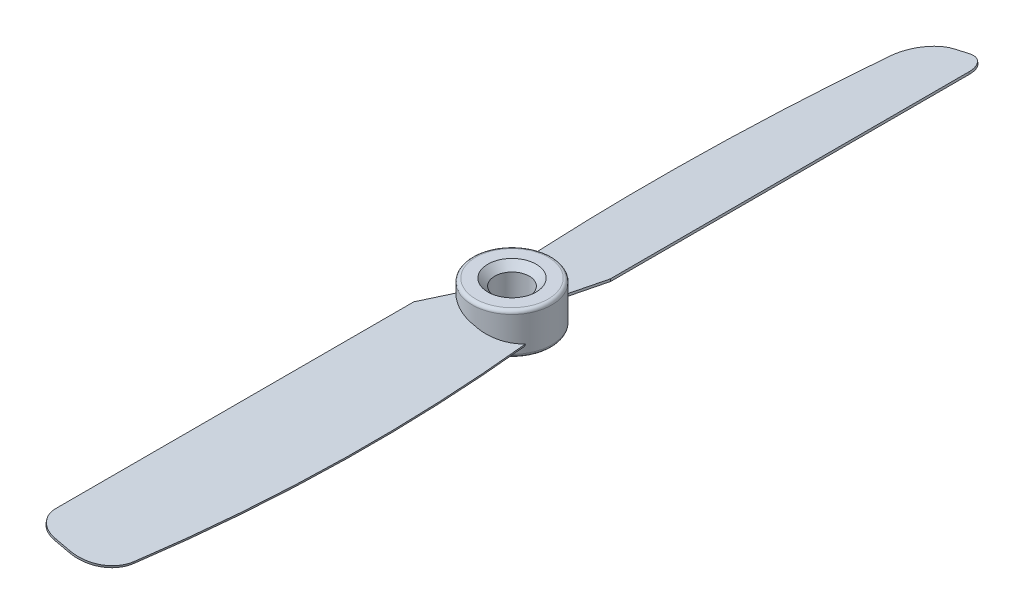
ISO-10303-21;
HEADER;
FILE_DESCRIPTION(('STEP AP214'),'2;1');
FILE_NAME('part.step','',(''),(''),'','','');
FILE_SCHEMA(('AUTOMOTIVE_DESIGN { 1 0 10303 214 1 1 1 1 }'));
ENDSEC;
DATA;
#1=APPLICATION_CONTEXT('core data for automotive mechanical design processes');
#2=APPLICATION_PROTOCOL_DEFINITION('international standard','automotive_design',2000,#1);
#3=PRODUCT_CONTEXT('',#1,'mechanical');
#4=PRODUCT('Part','Part','',(#3));
#5=PRODUCT_RELATED_PRODUCT_CATEGORY('part','',(#4));
#6=PRODUCT_DEFINITION_FORMATION('','',#4);
#7=PRODUCT_DEFINITION_CONTEXT('part definition',#1,'design');
#8=PRODUCT_DEFINITION('design','',#6,#7);
#9=PRODUCT_DEFINITION_SHAPE('','',#8);
#10=(LENGTH_UNIT() NAMED_UNIT(*) SI_UNIT(.MILLI.,.METRE.));
#11=(NAMED_UNIT(*) PLANE_ANGLE_UNIT() SI_UNIT($,.RADIAN.));
#12=(NAMED_UNIT(*) SI_UNIT($,.STERADIAN.) SOLID_ANGLE_UNIT());
#13=UNCERTAINTY_MEASURE_WITH_UNIT(LENGTH_MEASURE(1.E-05),#10,'distance_accuracy_value','');
#14=(GEOMETRIC_REPRESENTATION_CONTEXT(3) GLOBAL_UNCERTAINTY_ASSIGNED_CONTEXT((#13)) GLOBAL_UNIT_ASSIGNED_CONTEXT((#10,
#11,#12)) REPRESENTATION_CONTEXT('',''));
#15=CARTESIAN_POINT('',(0.,0.,0.));
#16=DIRECTION('',(0.,0.,1.));
#17=DIRECTION('',(1.,0.,0.));
#18=AXIS2_PLACEMENT_3D('',#15,#16,#17);
#19=CARTESIAN_POINT('',(0.,3.,0.));
#20=DIRECTION('',(0.,-1.,0.));
#21=DIRECTION('',(0.,0.,-1.));
#22=AXIS2_PLACEMENT_3D('',#19,#20,#21);
#23=CYLINDRICAL_SURFACE('',#22,5.75);
#24=CARTESIAN_POINT('',(0.,2.5,0.));
#25=DIRECTION('',(0.,1.,0.));
#26=DIRECTION('',(0.,0.,1.));
#27=AXIS2_PLACEMENT_3D('',#24,#25,#26);
#28=CIRCLE('',#27,5.75);
#29=CARTESIAN_POINT('',(0.,2.5,5.75));
#30=VERTEX_POINT('',#29);
#31=EDGE_CURVE('E397',#30,#30,#28,.F.);
#32=ORIENTED_EDGE('',*,*,#31,.T.);
#33=EDGE_LOOP('',(#32));
#34=FACE_BOUND('',#33,.T.);
#35=CARTESIAN_POINT('',(0.,-2.5,0.));
#36=DIRECTION('',(0.,1.,0.));
#37=DIRECTION('',(0.,0.,1.));
#38=AXIS2_PLACEMENT_3D('',#35,#36,#37);
#39=CIRCLE('',#38,5.75);
#40=CARTESIAN_POINT('',(0.,-2.5,5.75));
#41=VERTEX_POINT('',#40);
#42=EDGE_CURVE('E392',#41,#41,#39,.T.);
#43=ORIENTED_EDGE('',*,*,#42,.T.);
#44=EDGE_LOOP('',(#43));
#45=FACE_BOUND('',#44,.T.);
#46=CARTESIAN_POINT('',(0.,-0.153945616169008,0.));
#47=DIRECTION('',(0.224951054343866,0.974370064785235,0.));
#48=DIRECTION('',(0.974370064785235,-0.224951054343866,0.));
#49=AXIS2_PLACEMENT_3D('',#46,#47,#48);
#50=ELLIPSE('',#49,5.901248619812,5.75);
#51=CARTESIAN_POINT('',(-4.13908294867461,0.801636977110163,3.99130208628601));
#52=VERTEX_POINT('',#51);
#53=CARTESIAN_POINT('',(0.320003598355035,-0.227824268074907,5.74108854635071));
#54=VERTEX_POINT('',#53);
#55=EDGE_CURVE('E381',#52,#54,#50,.T.);
#56=ORIENTED_EDGE('',*,*,#55,.F.);
#57=CARTESIAN_POINT('',(0.,12.3222763067518,0.));
#58=DIRECTION('',(0.916439126793901,-0.211576643479599,0.33966844247757));
#59=DIRECTION('',(-0.198388347034774,-0.977361409067243,-0.0735305366966899));
#60=AXIS2_PLACEMENT_3D('',#57,#58,#59);
#61=ELLIPSE('',#60,27.1769128455544,5.75);
#62=CARTESIAN_POINT('',(-4.08947714195062,1.09807580658049,4.04211290112775));
#63=VERTEX_POINT('',#62);
#64=EDGE_CURVE('E379',#63,#52,#61,.T.);
#65=ORIENTED_EDGE('',*,*,#64,.F.);
#66=CARTESIAN_POINT('',(0.,0.153945616169009,0.));
#67=DIRECTION('',(0.224951054343866,0.974370064785235,0.));
#68=DIRECTION('',(0.974370064785235,-0.224951054343866,0.));
#69=AXIS2_PLACEMENT_3D('',#66,#67,#68);
#70=ELLIPSE('',#69,5.901248619812,5.75);
#71=CARTESIAN_POINT('',(0.354622157582683,0.0720746401148501,5.73905420129059));
#72=VERTEX_POINT('',#71);
#73=EDGE_CURVE('E374',#63,#72,#70,.T.);
#74=ORIENTED_EDGE('',*,*,#73,.T.);
#75=CARTESIAN_POINT('',(0.320003598355667,-0.227824268075053,5.7410885463507));
#76=CARTESIAN_POINT('',(0.325773371717421,-0.177840999841731,5.74076694689687));
#77=CARTESIAN_POINT('',(0.331543138333911,-0.127857790042578,5.74043661841495));
#78=CARTESIAN_POINT('',(0.343082658076362,-0.0278914873126147,5.73975850339491));
#79=CARTESIAN_POINT('',(0.348852411202323,0.0220916056181969,5.7394107168568));
#80=CARTESIAN_POINT('',(0.35462215758302,0.0720746401148383,5.73905420129059));
#81=B_SPLINE_CURVE_WITH_KNOTS('',3,(#75,#76,#77,#78,#79,#80),.UNSPECIFIED.,.F.,.F.,(4,2,4),(0.,
0.150948617979321,0.301897235958643),.UNSPECIFIED.);
#82=EDGE_CURVE('E226',#54,#72,#81,.T.);
#83=ORIENTED_EDGE('',*,*,#82,.F.);
#84=EDGE_LOOP('',(#56,#65,#74,#83));
#85=FACE_BOUND('',#84,.T.);
#86=CARTESIAN_POINT('',(0.,-0.153945616169008,0.));
#87=DIRECTION('',(-0.224951054343866,0.974370064785235,0.));
#88=DIRECTION('',(-0.974370064785235,-0.224951054343866,0.));
#89=AXIS2_PLACEMENT_3D('',#86,#87,#88);
#90=ELLIPSE('',#89,5.901248619812,5.75);
#91=CARTESIAN_POINT('',(4.13908294867461,0.801636977110163,-3.99130208628601));
#92=VERTEX_POINT('',#91);
#93=CARTESIAN_POINT('',(-0.320003598355035,-0.227824268074907,-5.74108854635071));
#94=VERTEX_POINT('',#93);
#95=EDGE_CURVE('E389',#92,#94,#90,.T.);
#96=ORIENTED_EDGE('',*,*,#95,.F.);
#97=CARTESIAN_POINT('',(0.,12.3222763067518,0.));
#98=DIRECTION('',(-0.916439126793901,-0.211576643479599,-0.33966844247757));
#99=DIRECTION('',(0.198388347034774,-0.977361409067243,0.0735305366966899));
#100=AXIS2_PLACEMENT_3D('',#97,#98,#99);
#101=ELLIPSE('',#100,27.1769128455544,5.75);
#102=CARTESIAN_POINT('',(4.08947714195062,1.09807580658049,-4.04211290112775));
#103=VERTEX_POINT('',#102);
#104=EDGE_CURVE('E243',#103,#92,#101,.T.);
#105=ORIENTED_EDGE('',*,*,#104,.F.);
#106=CARTESIAN_POINT('',(0.,0.153945616169009,0.));
#107=DIRECTION('',(-0.224951054343866,0.974370064785235,0.));
#108=DIRECTION('',(-0.974370064785235,-0.224951054343866,0.));
#109=AXIS2_PLACEMENT_3D('',#106,#107,#108);
#110=ELLIPSE('',#109,5.901248619812,5.75);
#111=CARTESIAN_POINT('',(-0.354622157582683,0.0720746401148501,-5.73905420129059));
#112=VERTEX_POINT('',#111);
#113=EDGE_CURVE('E244',#103,#112,#110,.T.);
#114=ORIENTED_EDGE('',*,*,#113,.T.);
#115=CARTESIAN_POINT('',(-0.320003598355667,-0.227824268075053,-5.7410885463507));
#116=CARTESIAN_POINT('',(-0.325773371717421,-0.177840999841731,-5.74076694689687));
#117=CARTESIAN_POINT('',(-0.331543138333911,-0.127857790042578,-5.74043661841495));
#118=CARTESIAN_POINT('',(-0.343082658076362,-0.0278914873126147,-5.73975850339491));
#119=CARTESIAN_POINT('',(-0.348852411202323,0.0220916056181969,-5.7394107168568));
#120=CARTESIAN_POINT('',(-0.35462215758302,0.0720746401148383,-5.73905420129059));
#121=B_SPLINE_CURVE_WITH_KNOTS('',3,(#115,#116,#117,#118,#119,#120),.UNSPECIFIED.,.F.,.F.,(4,2,
4),(0.,0.150948617979321,0.301897235958643),.UNSPECIFIED.);
#122=EDGE_CURVE('E235',#94,#112,#121,.T.);
#123=ORIENTED_EDGE('',*,*,#122,.F.);
#124=EDGE_LOOP('',(#96,#105,#114,#123));
#125=FACE_BOUND('',#124,.T.);
#126=ADVANCED_FACE('F43',(#34,#45,#85,#125),#23,.T.);
#127=CARTESIAN_POINT('',(0.,3.,0.));
#128=DIRECTION('',(0.,1.,0.));
#129=DIRECTION('',(0.,0.,1.));
#130=AXIS2_PLACEMENT_3D('',#127,#128,#129);
#131=PLANE('',#130);
#132=CARTESIAN_POINT('',(0.,3.,0.));
#133=DIRECTION('',(0.,1.,0.));
#134=DIRECTION('',(0.,0.,1.));
#135=AXIS2_PLACEMENT_3D('',#132,#133,#134);
#136=CIRCLE('',#135,3.5);
#137=CARTESIAN_POINT('',(0.,3.,3.5));
#138=VERTEX_POINT('',#137);
#139=EDGE_CURVE('E52',#138,#138,#136,.F.);
#140=ORIENTED_EDGE('',*,*,#139,.T.);
#141=EDGE_LOOP('',(#140));
#142=FACE_BOUND('',#141,.T.);
#143=CARTESIAN_POINT('',(0.,3.,0.));
#144=DIRECTION('',(0.,1.,0.));
#145=DIRECTION('',(0.,0.,1.));
#146=AXIS2_PLACEMENT_3D('',#143,#144,#145);
#147=CIRCLE('',#146,5.25);
#148=CARTESIAN_POINT('',(0.,3.,5.25));
#149=VERTEX_POINT('',#148);
#150=EDGE_CURVE('E390',#149,#149,#147,.T.);
#151=ORIENTED_EDGE('',*,*,#150,.T.);
#152=EDGE_LOOP('',(#151));
#153=FACE_BOUND('',#152,.T.);
#154=ADVANCED_FACE('F210',(#142,#153),#131,.T.);
#155=CARTESIAN_POINT('',(0.,-3.,0.));
#156=DIRECTION('',(0.,1.,0.));
#157=DIRECTION('',(0.,0.,1.));
#158=AXIS2_PLACEMENT_3D('',#155,#156,#157);
#159=PLANE('',#158);
#160=CARTESIAN_POINT('',(0.,-3.,0.));
#161=DIRECTION('',(0.,1.,0.));
#162=DIRECTION('',(0.,0.,1.));
#163=AXIS2_PLACEMENT_3D('',#160,#161,#162);
#164=CIRCLE('',#163,3.5);
#165=CARTESIAN_POINT('',(0.,-3.,3.5));
#166=VERTEX_POINT('',#165);
#167=EDGE_CURVE('E11',#166,#166,#164,.T.);
#168=ORIENTED_EDGE('',*,*,#167,.T.);
#169=EDGE_LOOP('',(#168));
#170=FACE_BOUND('',#169,.T.);
#171=CARTESIAN_POINT('',(0.,-3.,0.));
#172=DIRECTION('',(0.,1.,0.));
#173=DIRECTION('',(0.,0.,1.));
#174=AXIS2_PLACEMENT_3D('',#171,#172,#173);
#175=CIRCLE('',#174,5.25);
#176=CARTESIAN_POINT('',(0.,-3.,5.25));
#177=VERTEX_POINT('',#176);
#178=EDGE_CURVE('E400',#177,#177,#175,.F.);
#179=ORIENTED_EDGE('',*,*,#178,.T.);
#180=EDGE_LOOP('',(#179));
#181=FACE_BOUND('',#180,.T.);
#182=ADVANCED_FACE('F213',(#170,#181),#159,.F.);
#183=CARTESIAN_POINT('',(0.623814062032038,-0.297964440269035,0.));
#184=DIRECTION('',(0.224951054343865,0.974370064785235,0.));
#185=DIRECTION('',(0.,0.,1.));
#186=AXIS2_PLACEMENT_3D('',#183,#184,#185);
#187=ELLIPSE('',#186,5.75,5.6026278725151);
#188=DIRECTION('',(0.224951054343865,0.974370064785235,0.));
#189=VECTOR('',#188,1.);
#190=SURFACE_OF_LINEAR_EXTRUSION('',#187,#189);
#191=CARTESIAN_POINT('',(5.12632936616881,-1.33745200405026,3.25133734496482));
#192=VERTEX_POINT('',#191);
#193=EDGE_CURVE('E335',#54,#192,#187,.T.);
#194=ORIENTED_EDGE('',*,*,#193,.F.);
#195=ORIENTED_EDGE('',*,*,#82,.T.);
#196=CARTESIAN_POINT('',(0.691299378335197,-0.00565342083346486,0.));
#197=DIRECTION('',(0.224951054343865,0.974370064785235,0.));
#198=DIRECTION('',(0.,0.,1.));
#199=AXIS2_PLACEMENT_3D('',#196,#197,#198);
#200=ELLIPSE('',#199,5.75,5.6026278725151);
#201=CARTESIAN_POINT('',(5.19381468247197,-1.04514098461469,3.25133734496482));
#202=VERTEX_POINT('',#201);
#203=EDGE_CURVE('E67',#72,#202,#200,.T.);
#204=ORIENTED_EDGE('',*,*,#203,.T.);
#205=DIRECTION('',(0.224951054343865,0.974370064785235,0.));
#206=VECTOR('',#205,1.);
#207=CARTESIAN_POINT('',(5.12632936616881,-1.33745200405026,3.25133734496482));
#208=LINE('',#207,#206);
#209=EDGE_CURVE('E338',#192,#202,#208,.T.);
#210=ORIENTED_EDGE('',*,*,#209,.F.);
#211=EDGE_LOOP('',(#194,#195,#204,#210));
#212=FACE_BOUND('',#211,.T.);
#213=ADVANCED_FACE('F207',(#212),#190,.F.);
#214=CARTESIAN_POINT('',(5.12632936616881,-1.33745200405026,3.25133734496482));
#215=CARTESIAN_POINT('',(6.7170912438034,-1.70470832125126,21.8915988767489));
#216=CARTESIAN_POINT('',(6.43043585913104,-1.63852871111555,40.5220950728964));
#217=CARTESIAN_POINT('',(4.26734152271033,-1.13913903443215,59.0934670240778));
#218=B_SPLINE_CURVE_WITH_KNOTS('',3,(#214,#215,#216,#217),.UNSPECIFIED.,.F.,.F.,(4,4),(0.,
0.92669281817516),.UNSPECIFIED.);
#219=DIRECTION('',(0.224951054343865,0.974370064785235,0.));
#220=VECTOR('',#219,1.);
#221=SURFACE_OF_LINEAR_EXTRUSION('',#218,#220);
#222=CARTESIAN_POINT('',(5.19381468247197,-1.04514098461469,3.25133734496482));
#223=CARTESIAN_POINT('',(6.78457656010656,-1.41239730181569,21.8915988767489));
#224=CARTESIAN_POINT('',(6.4979211754342,-1.34621769167998,40.5220950728964));
#225=CARTESIAN_POINT('',(4.33482683901349,-0.84682801499658,59.0934670240778));
#226=B_SPLINE_CURVE_WITH_KNOTS('',3,(#222,#223,#224,#225),.UNSPECIFIED.,.F.,.F.,(4,4),(0.,
0.92669281817516),.UNSPECIFIED.);
#227=CARTESIAN_POINT('',(4.33482683901349,-0.84682801499658,59.0934670240778));
#228=VERTEX_POINT('',#227);
#229=EDGE_CURVE('E181',#202,#228,#226,.T.);
#230=ORIENTED_EDGE('',*,*,#229,.T.);
#231=DIRECTION('',(0.224951054343865,0.974370064785235,0.));
#232=VECTOR('',#231,1.);
#233=CARTESIAN_POINT('',(4.26734152271033,-1.13913903443215,59.0934670240778));
#234=LINE('',#233,#232);
#235=CARTESIAN_POINT('',(4.26734152271033,-1.13913903443215,59.0934670240778));
#236=VERTEX_POINT('',#235);
#237=EDGE_CURVE('E372',#236,#228,#234,.T.);
#238=ORIENTED_EDGE('',*,*,#237,.F.);
#239=EDGE_CURVE('E190',#192,#236,#218,.T.);
#240=ORIENTED_EDGE('',*,*,#239,.F.);
#241=ORIENTED_EDGE('',*,*,#209,.T.);
#242=EDGE_LOOP('',(#230,#238,#240,#241));
#243=FACE_BOUND('',#242,.T.);
#244=ADVANCED_FACE('F202',(#243),#221,.F.);
#245=CARTESIAN_POINT('',(-0.570069457951375,-0.0223347115958443,58.5));
#246=DIRECTION('',(0.224951054343865,0.974370064785235,0.));
#247=DIRECTION('',(-0.974370064785235,0.224951054343865,0.));
#248=AXIS2_PLACEMENT_3D('',#245,#246,#247);
#249=CYLINDRICAL_SURFACE('',#248,5.);
#250=CARTESIAN_POINT('',(-0.502584141648216,0.269976307839726,58.5));
#251=DIRECTION('',(-0.224951054343865,-0.974370064785235,0.));
#252=DIRECTION('',(0.974370064785235,-0.224951054343865,0.));
#253=AXIS2_PLACEMENT_3D('',#250,#251,#252);
#254=CIRCLE('',#253,5.);
#255=CARTESIAN_POINT('',(-0.502584141648216,0.269976307839726,63.5));
#256=VERTEX_POINT('',#255);
#257=EDGE_CURVE('E184',#228,#256,#254,.T.);
#258=ORIENTED_EDGE('',*,*,#257,.T.);
#259=DIRECTION('',(0.224951054343865,0.974370064785235,0.));
#260=VECTOR('',#259,1.);
#261=CARTESIAN_POINT('',(-0.570069457951375,-0.0223347115958443,63.5));
#262=LINE('',#261,#260);
#263=CARTESIAN_POINT('',(-0.570069457951375,-0.0223347115958443,63.5));
#264=VERTEX_POINT('',#263);
#265=EDGE_CURVE('E369',#264,#256,#262,.T.);
#266=ORIENTED_EDGE('',*,*,#265,.F.);
#267=CARTESIAN_POINT('',(-0.570069457951375,-0.0223347115958443,58.5));
#268=DIRECTION('',(-0.224951054343865,-0.974370064785235,0.));
#269=DIRECTION('',(0.974370064785235,-0.224951054343865,0.));
#270=AXIS2_PLACEMENT_3D('',#267,#268,#269);
#271=CIRCLE('',#270,5.);
#272=EDGE_CURVE('E196',#236,#264,#271,.T.);
#273=ORIENTED_EDGE('',*,*,#272,.F.);
#274=ORIENTED_EDGE('',*,*,#237,.T.);
#275=EDGE_LOOP('',(#258,#266,#273,#274));
#276=FACE_BOUND('',#275,.T.);
#277=ADVANCED_FACE('F206',(#276),#249,.T.);
#278=CARTESIAN_POINT('',(-2.81961462573802,0.497013712146312,63.5));
#279=DIRECTION('',(0.,0.,-1.));
#280=DIRECTION('',(-1.,0.,0.));
#281=AXIS2_PLACEMENT_3D('',#278,#279,#280);
#282=PLANE('',#281);
#283=DIRECTION('',(-0.974370064785235,0.224951054343865,0.));
#284=VECTOR('',#283,1.);
#285=CARTESIAN_POINT('',(-2.75212930943486,0.789324731581882,63.5));
#286=LINE('',#285,#284);
#287=CARTESIAN_POINT('',(-2.75212930943486,0.789324731581882,63.5));
#288=VERTEX_POINT('',#287);
#289=EDGE_CURVE('E348',#256,#288,#286,.T.);
#290=ORIENTED_EDGE('',*,*,#289,.T.);
#291=DIRECTION('',(0.224951054343865,0.974370064785235,0.));
#292=VECTOR('',#291,1.);
#293=CARTESIAN_POINT('',(-2.81961462573802,0.497013712146312,63.5));
#294=LINE('',#293,#292);
#295=CARTESIAN_POINT('',(-2.81961462573802,0.497013712146312,63.5));
#296=VERTEX_POINT('',#295);
#297=EDGE_CURVE('E366',#296,#288,#294,.T.);
#298=ORIENTED_EDGE('',*,*,#297,.F.);
#299=DIRECTION('',(-0.974370064785235,0.224951054343865,0.));
#300=VECTOR('',#299,1.);
#301=CARTESIAN_POINT('',(-2.81961462573802,0.497013712146312,63.5));
#302=LINE('',#301,#300);
#303=EDGE_CURVE('E627',#264,#296,#302,.T.);
#304=ORIENTED_EDGE('',*,*,#303,.F.);
#305=ORIENTED_EDGE('',*,*,#265,.T.);
#306=EDGE_LOOP('',(#290,#298,#304,#305));
#307=FACE_BOUND('',#306,.T.);
#308=ADVANCED_FACE('F540',(#307),#282,.F.);
#309=CARTESIAN_POINT('',(-2.81961462573804,0.497013712146317,60.5));
#310=DIRECTION('',(0.224951054343865,0.974370064785235,0.));
#311=DIRECTION('',(-0.974370064785235,0.224951054343865,0.));
#312=AXIS2_PLACEMENT_3D('',#309,#310,#311);
#313=CYLINDRICAL_SURFACE('',#312,3.);
#314=CARTESIAN_POINT('',(-2.75212930943489,0.789324731581887,60.5));
#315=DIRECTION('',(-0.224951054343865,-0.974370064785235,0.));
#316=DIRECTION('',(-0.974370064785235,0.224951054343865,0.));
#317=AXIS2_PLACEMENT_3D('',#314,#315,#316);
#318=CIRCLE('',#317,3.);
#319=CARTESIAN_POINT('',(-5.67523950379059,1.46417789461348,60.5));
#320=VERTEX_POINT('',#319);
#321=EDGE_CURVE('E350',#288,#320,#318,.T.);
#322=ORIENTED_EDGE('',*,*,#321,.T.);
#323=DIRECTION('',(0.224951054343865,0.974370064785235,0.));
#324=VECTOR('',#323,1.);
#325=CARTESIAN_POINT('',(-5.74272482009375,1.17186687517791,60.5));
#326=LINE('',#325,#324);
#327=CARTESIAN_POINT('',(-5.74272482009375,1.17186687517791,60.5));
#328=VERTEX_POINT('',#327);
#329=EDGE_CURVE('E363',#328,#320,#326,.T.);
#330=ORIENTED_EDGE('',*,*,#329,.F.);
#331=CARTESIAN_POINT('',(-2.81961462573804,0.497013712146317,60.5));
#332=DIRECTION('',(-0.224951054343865,-0.974370064785235,0.));
#333=DIRECTION('',(-0.974370064785235,0.224951054343865,0.));
#334=AXIS2_PLACEMENT_3D('',#331,#332,#333);
#335=CIRCLE('',#334,3.);
#336=EDGE_CURVE('E636',#296,#328,#335,.T.);
#337=ORIENTED_EDGE('',*,*,#336,.F.);
#338=ORIENTED_EDGE('',*,*,#297,.T.);
#339=EDGE_LOOP('',(#322,#330,#337,#338));
#340=FACE_BOUND('',#339,.T.);
#341=ADVANCED_FACE('F532',(#340),#313,.T.);
#342=CARTESIAN_POINT('',(-5.74272482009375,1.17186687517791,8.54860550897499));
#343=DIRECTION('',(0.974370064785235,-0.224951054343865,0.));
#344=DIRECTION('',(0.224951054343865,0.974370064785235,0.));
#345=AXIS2_PLACEMENT_3D('',#342,#343,#344);
#346=PLANE('',#345);
#347=DIRECTION('',(0.,0.,-1.));
#348=VECTOR('',#347,1.);
#349=CARTESIAN_POINT('',(-5.67523950379059,1.46417789461348,8.54860550897499));
#350=LINE('',#349,#348);
#351=CARTESIAN_POINT('',(-5.67523950379059,1.46417789461348,8.54860550897499));
#352=VERTEX_POINT('',#351);
#353=EDGE_CURVE('E352',#320,#352,#350,.T.);
#354=ORIENTED_EDGE('',*,*,#353,.T.);
#355=DIRECTION('',(0.224951054343865,0.974370064785235,0.));
#356=VECTOR('',#355,1.);
#357=CARTESIAN_POINT('',(-5.74272482009375,1.17186687517791,8.54860550897499));
#358=LINE('',#357,#356);
#359=CARTESIAN_POINT('',(-5.74272482009375,1.17186687517791,8.54860550897499));
#360=VERTEX_POINT('',#359);
#361=EDGE_CURVE('E360',#360,#352,#358,.T.);
#362=ORIENTED_EDGE('',*,*,#361,.F.);
#363=DIRECTION('',(0.,0.,-1.));
#364=VECTOR('',#363,1.);
#365=CARTESIAN_POINT('',(-5.74272482009375,1.17186687517791,8.54860550897499));
#366=LINE('',#365,#364);
#367=EDGE_CURVE('E635',#328,#360,#366,.T.);
#368=ORIENTED_EDGE('',*,*,#367,.F.);
#369=ORIENTED_EDGE('',*,*,#329,.T.);
#370=EDGE_LOOP('',(#354,#362,#368,#369));
#371=FACE_BOUND('',#370,.T.);
#372=ADVANCED_FACE('F525',(#371),#346,.F.);
#373=CARTESIAN_POINT('',(-3.87870124210473,0.741523123512188,3.25133734496482));
#374=DIRECTION('',(0.916439126793901,-0.211576643479599,0.33966844247757));
#375=DIRECTION('',(0.347536171703093,0.,-0.937666576858725));
#376=AXIS2_PLACEMENT_3D('',#373,#374,#375);
#377=PLANE('',#376);
#378=DIRECTION('',(0.33096276230237,-0.0764087742626679,-0.94054524037117));
#379=VECTOR('',#378,1.);
#380=CARTESIAN_POINT('',(-3.81121592580157,1.03383414294776,3.25133734496482));
#381=LINE('',#380,#379);
#382=EDGE_CURVE('E354',#352,#63,#381,.T.);
#383=ORIENTED_EDGE('',*,*,#382,.T.);
#384=ORIENTED_EDGE('',*,*,#64,.T.);
#385=DIRECTION('',(0.33096276230237,-0.0764087742626679,-0.94054524037117));
#386=VECTOR('',#385,1.);
#387=CARTESIAN_POINT('',(-3.87870124210473,0.741523123512188,3.25133734496482));
#388=LINE('',#387,#386);
#389=EDGE_CURVE('E339',#360,#52,#388,.T.);
#390=ORIENTED_EDGE('',*,*,#389,.F.);
#391=ORIENTED_EDGE('',*,*,#361,.T.);
#392=EDGE_LOOP('',(#383,#384,#390,#391));
#393=FACE_BOUND('',#392,.T.);
#394=ADVANCED_FACE('F326',(#393),#377,.F.);
#395=CARTESIAN_POINT('',(6.10453152471031,-1.56328776694786,31.1982357772473));
#396=DIRECTION('',(0.224951054343866,0.974370064785235,0.));
#397=DIRECTION('',(-0.974370064785235,0.224951054343866,0.));
#398=AXIS2_PLACEMENT_3D('',#395,#396,#397);
#399=PLANE('',#398);
#400=ORIENTED_EDGE('',*,*,#389,.T.);
#401=ORIENTED_EDGE('',*,*,#55,.T.);
#402=ORIENTED_EDGE('',*,*,#193,.T.);
#403=ORIENTED_EDGE('',*,*,#239,.T.);
#404=ORIENTED_EDGE('',*,*,#272,.T.);
#405=ORIENTED_EDGE('',*,*,#303,.T.);
#406=ORIENTED_EDGE('',*,*,#336,.T.);
#407=ORIENTED_EDGE('',*,*,#367,.T.);
#408=EDGE_LOOP('',(#400,#401,#402,#403,#404,#405,#406,#407));
#409=FACE_BOUND('',#408,.T.);
#410=ADVANCED_FACE('F323',(#409),#399,.F.);
#411=CARTESIAN_POINT('',(6.17201684101347,-1.27097674751229,31.1982357772473));
#412=DIRECTION('',(0.224951054343866,0.974370064785235,0.));
#413=DIRECTION('',(-0.974370064785235,0.224951054343866,0.));
#414=AXIS2_PLACEMENT_3D('',#411,#412,#413);
#415=PLANE('',#414);
#416=ORIENTED_EDGE('',*,*,#73,.F.);
#417=ORIENTED_EDGE('',*,*,#382,.F.);
#418=ORIENTED_EDGE('',*,*,#353,.F.);
#419=ORIENTED_EDGE('',*,*,#321,.F.);
#420=ORIENTED_EDGE('',*,*,#289,.F.);
#421=ORIENTED_EDGE('',*,*,#257,.F.);
#422=ORIENTED_EDGE('',*,*,#229,.F.);
#423=ORIENTED_EDGE('',*,*,#203,.F.);
#424=EDGE_LOOP('',(#416,#417,#418,#419,#420,#421,#422,#423));
#425=FACE_BOUND('',#424,.T.);
#426=ADVANCED_FACE('F253',(#425),#415,.T.);
#427=CARTESIAN_POINT('',(-0.623814062032038,-0.297964440269035,0.));
#428=DIRECTION('',(-0.224951054343865,0.974370064785235,0.));
#429=DIRECTION('',(0.,0.,-1.));
#430=AXIS2_PLACEMENT_3D('',#427,#428,#429);
#431=ELLIPSE('',#430,5.75,5.6026278725151);
#432=DIRECTION('',(-0.224951054343865,0.974370064785235,0.));
#433=VECTOR('',#432,1.);
#434=SURFACE_OF_LINEAR_EXTRUSION('',#431,#433);
#435=CARTESIAN_POINT('',(-5.12632936616881,-1.33745200405026,-3.25133734496482));
#436=VERTEX_POINT('',#435);
#437=EDGE_CURVE('E174',#94,#436,#431,.T.);
#438=ORIENTED_EDGE('',*,*,#437,.F.);
#439=ORIENTED_EDGE('',*,*,#122,.T.);
#440=CARTESIAN_POINT('',(-0.691299378335197,-0.00565342083346486,0.));
#441=DIRECTION('',(-0.224951054343865,0.974370064785235,0.));
#442=DIRECTION('',(0.,0.,-1.));
#443=AXIS2_PLACEMENT_3D('',#440,#441,#442);
#444=ELLIPSE('',#443,5.75,5.6026278725151);
#445=CARTESIAN_POINT('',(-5.19381468247197,-1.04514098461469,-3.25133734496482));
#446=VERTEX_POINT('',#445);
#447=EDGE_CURVE('E59',#112,#446,#444,.T.);
#448=ORIENTED_EDGE('',*,*,#447,.T.);
#449=DIRECTION('',(-0.224951054343865,0.974370064785235,0.));
#450=VECTOR('',#449,1.);
#451=CARTESIAN_POINT('',(-5.12632936616881,-1.33745200405026,-3.25133734496482));
#452=LINE('',#451,#450);
#453=EDGE_CURVE('E262',#436,#446,#452,.T.);
#454=ORIENTED_EDGE('',*,*,#453,.F.);
#455=EDGE_LOOP('',(#438,#439,#448,#454));
#456=FACE_BOUND('',#455,.T.);
#457=ADVANCED_FACE('F247',(#456),#434,.F.);
#458=CARTESIAN_POINT('',(-5.12632936616881,-1.33745200405026,-3.25133734496482));
#459=CARTESIAN_POINT('',(-6.7170912438034,-1.70470832125126,-21.8915988767489));
#460=CARTESIAN_POINT('',(-6.43043585913104,-1.63852871111555,-40.5220950728964));
#461=CARTESIAN_POINT('',(-4.26734152271033,-1.13913903443215,-59.0934670240778));
#462=B_SPLINE_CURVE_WITH_KNOTS('',3,(#458,#459,#460,#461),.UNSPECIFIED.,.F.,.F.,(4,4),(0.,
0.92669281817516),.UNSPECIFIED.);
#463=DIRECTION('',(-0.224951054343865,0.974370064785235,0.));
#464=VECTOR('',#463,1.);
#465=SURFACE_OF_LINEAR_EXTRUSION('',#462,#464);
#466=CARTESIAN_POINT('',(-5.19381468247197,-1.04514098461469,-3.25133734496482));
#467=CARTESIAN_POINT('',(-6.78457656010656,-1.41239730181569,-21.8915988767489));
#468=CARTESIAN_POINT('',(-6.4979211754342,-1.34621769167998,-40.5220950728964));
#469=CARTESIAN_POINT('',(-4.33482683901349,-0.84682801499658,-59.0934670240778));
#470=B_SPLINE_CURVE_WITH_KNOTS('',3,(#466,#467,#468,#469),.UNSPECIFIED.,.F.,.F.,(4,4),(0.,
0.92669281817516),.UNSPECIFIED.);
#471=CARTESIAN_POINT('',(-4.33482683901349,-0.84682801499658,-59.0934670240778));
#472=VERTEX_POINT('',#471);
#473=EDGE_CURVE('E180',#446,#472,#470,.T.);
#474=ORIENTED_EDGE('',*,*,#473,.T.);
#475=DIRECTION('',(-0.224951054343865,0.974370064785235,0.));
#476=VECTOR('',#475,1.);
#477=CARTESIAN_POINT('',(-4.26734152271033,-1.13913903443215,-59.0934670240778));
#478=LINE('',#477,#476);
#479=CARTESIAN_POINT('',(-4.26734152271033,-1.13913903443215,-59.0934670240778));
#480=VERTEX_POINT('',#479);
#481=EDGE_CURVE('E161',#480,#472,#478,.T.);
#482=ORIENTED_EDGE('',*,*,#481,.F.);
#483=EDGE_CURVE('E168',#436,#480,#462,.T.);
#484=ORIENTED_EDGE('',*,*,#483,.F.);
#485=ORIENTED_EDGE('',*,*,#453,.T.);
#486=EDGE_LOOP('',(#474,#482,#484,#485));
#487=FACE_BOUND('',#486,.T.);
#488=ADVANCED_FACE('F179',(#487),#465,.F.);
#489=CARTESIAN_POINT('',(0.570069457951375,-0.0223347115958443,-58.5));
#490=DIRECTION('',(-0.224951054343865,0.974370064785235,0.));
#491=DIRECTION('',(-0.974370064785235,-0.224951054343865,0.));
#492=AXIS2_PLACEMENT_3D('',#489,#490,#491);
#493=CYLINDRICAL_SURFACE('',#492,5.);
#494=CARTESIAN_POINT('',(0.502584141648216,0.269976307839726,-58.5));
#495=DIRECTION('',(0.224951054343865,-0.974370064785235,0.));
#496=DIRECTION('',(-0.974370064785235,-0.224951054343865,0.));
#497=AXIS2_PLACEMENT_3D('',#494,#495,#496);
#498=CIRCLE('',#497,5.);
#499=CARTESIAN_POINT('',(0.502584141648216,0.269976307839726,-63.5));
#500=VERTEX_POINT('',#499);
#501=EDGE_CURVE('E268',#472,#500,#498,.T.);
#502=ORIENTED_EDGE('',*,*,#501,.T.);
#503=DIRECTION('',(-0.224951054343865,0.974370064785235,0.));
#504=VECTOR('',#503,1.);
#505=CARTESIAN_POINT('',(0.570069457951375,-0.0223347115958443,-63.5));
#506=LINE('',#505,#504);
#507=CARTESIAN_POINT('',(0.570069457951375,-0.0223347115958443,-63.5));
#508=VERTEX_POINT('',#507);
#509=EDGE_CURVE('E164',#508,#500,#506,.T.);
#510=ORIENTED_EDGE('',*,*,#509,.F.);
#511=CARTESIAN_POINT('',(0.570069457951375,-0.0223347115958443,-58.5));
#512=DIRECTION('',(0.224951054343865,-0.974370064785235,0.));
#513=DIRECTION('',(-0.974370064785235,-0.224951054343865,0.));
#514=AXIS2_PLACEMENT_3D('',#511,#512,#513);
#515=CIRCLE('',#514,5.);
#516=EDGE_CURVE('E157',#480,#508,#515,.T.);
#517=ORIENTED_EDGE('',*,*,#516,.F.);
#518=ORIENTED_EDGE('',*,*,#481,.T.);
#519=EDGE_LOOP('',(#502,#510,#517,#518));
#520=FACE_BOUND('',#519,.T.);
#521=ADVANCED_FACE('F159',(#520),#493,.T.);
#522=CARTESIAN_POINT('',(2.81961462573802,0.497013712146312,-63.5));
#523=DIRECTION('',(0.,0.,1.));
#524=DIRECTION('',(1.,0.,0.));
#525=AXIS2_PLACEMENT_3D('',#522,#523,#524);
#526=PLANE('',#525);
#527=DIRECTION('',(0.974370064785235,0.224951054343865,0.));
#528=VECTOR('',#527,1.);
#529=CARTESIAN_POINT('',(2.75212930943486,0.789324731581882,-63.5));
#530=LINE('',#529,#528);
#531=CARTESIAN_POINT('',(2.75212930943486,0.789324731581882,-63.5));
#532=VERTEX_POINT('',#531);
#533=EDGE_CURVE('E273',#500,#532,#530,.T.);
#534=ORIENTED_EDGE('',*,*,#533,.T.);
#535=DIRECTION('',(-0.224951054343865,0.974370064785235,0.));
#536=VECTOR('',#535,1.);
#537=CARTESIAN_POINT('',(2.81961462573802,0.497013712146312,-63.5));
#538=LINE('',#537,#536);
#539=CARTESIAN_POINT('',(2.81961462573802,0.497013712146312,-63.5));
#540=VERTEX_POINT('',#539);
#541=EDGE_CURVE('E186',#540,#532,#538,.T.);
#542=ORIENTED_EDGE('',*,*,#541,.F.);
#543=DIRECTION('',(0.974370064785235,0.224951054343865,0.));
#544=VECTOR('',#543,1.);
#545=CARTESIAN_POINT('',(2.81961462573802,0.497013712146312,-63.5));
#546=LINE('',#545,#544);
#547=EDGE_CURVE('E167',#508,#540,#546,.T.);
#548=ORIENTED_EDGE('',*,*,#547,.F.);
#549=ORIENTED_EDGE('',*,*,#509,.T.);
#550=EDGE_LOOP('',(#534,#542,#548,#549));
#551=FACE_BOUND('',#550,.T.);
#552=ADVANCED_FACE('F487',(#551),#526,.F.);
#553=CARTESIAN_POINT('',(2.81961462573804,0.497013712146317,-60.5));
#554=DIRECTION('',(-0.224951054343865,0.974370064785235,0.));
#555=DIRECTION('',(-0.974370064785235,-0.224951054343865,0.));
#556=AXIS2_PLACEMENT_3D('',#553,#554,#555);
#557=CYLINDRICAL_SURFACE('',#556,3.);
#558=CARTESIAN_POINT('',(2.75212930943489,0.789324731581887,-60.5));
#559=DIRECTION('',(0.224951054343865,-0.974370064785235,0.));
#560=DIRECTION('',(0.974370064785235,0.224951054343865,0.));
#561=AXIS2_PLACEMENT_3D('',#558,#559,#560);
#562=CIRCLE('',#561,3.);
#563=CARTESIAN_POINT('',(5.67523950379059,1.46417789461348,-60.5));
#564=VERTEX_POINT('',#563);
#565=EDGE_CURVE('E275',#532,#564,#562,.T.);
#566=ORIENTED_EDGE('',*,*,#565,.T.);
#567=DIRECTION('',(-0.224951054343865,0.974370064785235,0.));
#568=VECTOR('',#567,1.);
#569=CARTESIAN_POINT('',(5.74272482009375,1.17186687517791,-60.5));
#570=LINE('',#569,#568);
#571=CARTESIAN_POINT('',(5.74272482009375,1.17186687517791,-60.5));
#572=VERTEX_POINT('',#571);
#573=EDGE_CURVE('E287',#572,#564,#570,.T.);
#574=ORIENTED_EDGE('',*,*,#573,.F.);
#575=CARTESIAN_POINT('',(2.81961462573804,0.497013712146317,-60.5));
#576=DIRECTION('',(0.224951054343865,-0.974370064785235,0.));
#577=DIRECTION('',(0.974370064785235,0.224951054343865,0.));
#578=AXIS2_PLACEMENT_3D('',#575,#576,#577);
#579=CIRCLE('',#578,3.);
#580=EDGE_CURVE('E296',#540,#572,#579,.T.);
#581=ORIENTED_EDGE('',*,*,#580,.F.);
#582=ORIENTED_EDGE('',*,*,#541,.T.);
#583=EDGE_LOOP('',(#566,#574,#581,#582));
#584=FACE_BOUND('',#583,.T.);
#585=ADVANCED_FACE('F294',(#584),#557,.T.);
#586=CARTESIAN_POINT('',(5.74272482009375,1.17186687517791,-8.54860550897499));
#587=DIRECTION('',(-0.974370064785235,-0.224951054343865,0.));
#588=DIRECTION('',(0.224951054343865,-0.974370064785235,0.));
#589=AXIS2_PLACEMENT_3D('',#586,#587,#588);
#590=PLANE('',#589);
#591=DIRECTION('',(0.,0.,1.));
#592=VECTOR('',#591,1.);
#593=CARTESIAN_POINT('',(5.67523950379059,1.46417789461348,-8.54860550897499));
#594=LINE('',#593,#592);
#595=CARTESIAN_POINT('',(5.67523950379059,1.46417789461348,-8.54860550897499));
#596=VERTEX_POINT('',#595);
#597=EDGE_CURVE('E277',#564,#596,#594,.T.);
#598=ORIENTED_EDGE('',*,*,#597,.T.);
#599=DIRECTION('',(-0.224951054343865,0.974370064785235,0.));
#600=VECTOR('',#599,1.);
#601=CARTESIAN_POINT('',(5.74272482009375,1.17186687517791,-8.54860550897499));
#602=LINE('',#601,#600);
#603=CARTESIAN_POINT('',(5.74272482009375,1.17186687517791,-8.54860550897499));
#604=VERTEX_POINT('',#603);
#605=EDGE_CURVE('E284',#604,#596,#602,.T.);
#606=ORIENTED_EDGE('',*,*,#605,.F.);
#607=DIRECTION('',(0.,0.,1.));
#608=VECTOR('',#607,1.);
#609=CARTESIAN_POINT('',(5.74272482009375,1.17186687517791,-8.54860550897499));
#610=LINE('',#609,#608);
#611=EDGE_CURVE('E309',#572,#604,#610,.T.);
#612=ORIENTED_EDGE('',*,*,#611,.F.);
#613=ORIENTED_EDGE('',*,*,#573,.T.);
#614=EDGE_LOOP('',(#598,#606,#612,#613));
#615=FACE_BOUND('',#614,.T.);
#616=ADVANCED_FACE('F303',(#615),#590,.F.);
#617=CARTESIAN_POINT('',(3.87870124210473,0.741523123512188,-3.25133734496482));
#618=DIRECTION('',(-0.916439126793901,-0.211576643479599,-0.33966844247757));
#619=DIRECTION('',(-0.347536171703093,0.,0.937666576858725));
#620=AXIS2_PLACEMENT_3D('',#617,#618,#619);
#621=PLANE('',#620);
#622=DIRECTION('',(-0.33096276230237,-0.0764087742626679,0.94054524037117));
#623=VECTOR('',#622,1.);
#624=CARTESIAN_POINT('',(3.81121592580157,1.03383414294776,-3.25133734496482));
#625=LINE('',#624,#623);
#626=EDGE_CURVE('E279',#596,#103,#625,.T.);
#627=ORIENTED_EDGE('',*,*,#626,.T.);
#628=ORIENTED_EDGE('',*,*,#104,.T.);
#629=DIRECTION('',(-0.33096276230237,-0.0764087742626679,0.94054524037117));
#630=VECTOR('',#629,1.);
#631=CARTESIAN_POINT('',(3.87870124210473,0.741523123512188,-3.25133734496482));
#632=LINE('',#631,#630);
#633=EDGE_CURVE('E263',#604,#92,#632,.T.);
#634=ORIENTED_EDGE('',*,*,#633,.F.);
#635=ORIENTED_EDGE('',*,*,#605,.T.);
#636=EDGE_LOOP('',(#627,#628,#634,#635));
#637=FACE_BOUND('',#636,.T.);
#638=ADVANCED_FACE('F257',(#637),#621,.F.);
#639=CARTESIAN_POINT('',(-6.10453152471031,-1.56328776694786,-31.1982357772473));
#640=DIRECTION('',(-0.224951054343866,0.974370064785235,0.));
#641=DIRECTION('',(0.974370064785235,0.224951054343866,0.));
#642=AXIS2_PLACEMENT_3D('',#639,#640,#641);
#643=PLANE('',#642);
#644=ORIENTED_EDGE('',*,*,#633,.T.);
#645=ORIENTED_EDGE('',*,*,#95,.T.);
#646=ORIENTED_EDGE('',*,*,#437,.T.);
#647=ORIENTED_EDGE('',*,*,#483,.T.);
#648=ORIENTED_EDGE('',*,*,#516,.T.);
#649=ORIENTED_EDGE('',*,*,#547,.T.);
#650=ORIENTED_EDGE('',*,*,#580,.T.);
#651=ORIENTED_EDGE('',*,*,#611,.T.);
#652=EDGE_LOOP('',(#644,#645,#646,#647,#648,#649,#650,#651));
#653=FACE_BOUND('',#652,.T.);
#654=ADVANCED_FACE('F172',(#653),#643,.F.);
#655=CARTESIAN_POINT('',(-6.17201684101347,-1.27097674751229,-31.1982357772473));
#656=DIRECTION('',(-0.224951054343866,0.974370064785235,0.));
#657=DIRECTION('',(0.974370064785235,0.224951054343866,0.));
#658=AXIS2_PLACEMENT_3D('',#655,#656,#657);
#659=PLANE('',#658);
#660=ORIENTED_EDGE('',*,*,#113,.F.);
#661=ORIENTED_EDGE('',*,*,#626,.F.);
#662=ORIENTED_EDGE('',*,*,#597,.F.);
#663=ORIENTED_EDGE('',*,*,#565,.F.);
#664=ORIENTED_EDGE('',*,*,#533,.F.);
#665=ORIENTED_EDGE('',*,*,#501,.F.);
#666=ORIENTED_EDGE('',*,*,#473,.F.);
#667=ORIENTED_EDGE('',*,*,#447,.F.);
#668=EDGE_LOOP('',(#660,#661,#662,#663,#664,#665,#666,#667));
#669=FACE_BOUND('',#668,.T.);
#670=ADVANCED_FACE('F255',(#669),#659,.T.);
#671=CARTESIAN_POINT('',(0.,-3.,0.));
#672=DIRECTION('',(0.,1.,0.));
#673=DIRECTION('',(0.,0.,1.));
#674=AXIS2_PLACEMENT_3D('',#671,#672,#673);
#675=CYLINDRICAL_SURFACE('',#674,2.5);
#676=CARTESIAN_POINT('',(0.,2.00000000000002,0.));
#677=DIRECTION('',(0.,1.,0.));
#678=DIRECTION('',(0.,0.,1.));
#679=AXIS2_PLACEMENT_3D('',#676,#677,#678);
#680=CIRCLE('',#679,2.5);
#681=CARTESIAN_POINT('',(0.,2.00000000000002,2.5));
#682=VERTEX_POINT('',#681);
#683=EDGE_CURVE('E406',#682,#682,#680,.T.);
#684=ORIENTED_EDGE('',*,*,#683,.T.);
#685=EDGE_LOOP('',(#684));
#686=FACE_BOUND('',#685,.T.);
#687=CARTESIAN_POINT('',(0.,-1.99999999999999,0.));
#688=DIRECTION('',(0.,1.,0.));
#689=DIRECTION('',(0.,0.,1.));
#690=AXIS2_PLACEMENT_3D('',#687,#688,#689);
#691=CIRCLE('',#690,2.5);
#692=CARTESIAN_POINT('',(0.,-1.99999999999999,2.5));
#693=VERTEX_POINT('',#692);
#694=EDGE_CURVE('E403',#693,#693,#691,.F.);
#695=ORIENTED_EDGE('',*,*,#694,.T.);
#696=EDGE_LOOP('',(#695));
#697=FACE_BOUND('',#696,.T.);
#698=ADVANCED_FACE('F418',(#686,#697),#675,.F.);
#699=CARTESIAN_POINT('',(0.,2.5,0.));
#700=DIRECTION('',(0.,1.,0.));
#701=DIRECTION('',(0.,0.,1.));
#702=AXIS2_PLACEMENT_3D('',#699,#700,#701);
#703=TOROIDAL_SURFACE('',#702,5.25,0.5);
#704=ORIENTED_EDGE('',*,*,#31,.F.);
#705=EDGE_LOOP('',(#704));
#706=FACE_BOUND('',#705,.T.);
#707=ORIENTED_EDGE('',*,*,#150,.F.);
#708=EDGE_LOOP('',(#707));
#709=FACE_BOUND('',#708,.T.);
#710=ADVANCED_FACE('F222',(#706,#709),#703,.T.);
#711=CARTESIAN_POINT('',(0.,-2.5,0.));
#712=DIRECTION('',(0.,1.,0.));
#713=DIRECTION('',(0.,0.,1.));
#714=AXIS2_PLACEMENT_3D('',#711,#712,#713);
#715=TOROIDAL_SURFACE('',#714,5.25,0.5);
#716=ORIENTED_EDGE('',*,*,#178,.F.);
#717=EDGE_LOOP('',(#716));
#718=FACE_BOUND('',#717,.T.);
#719=ORIENTED_EDGE('',*,*,#42,.F.);
#720=EDGE_LOOP('',(#719));
#721=FACE_BOUND('',#720,.T.);
#722=ADVANCED_FACE('F415',(#718,#721),#715,.T.);
#723=CARTESIAN_POINT('',(0.,2.00000000000002,0.));
#724=DIRECTION('',(0.,1.,0.));
#725=DIRECTION('',(0.,0.,1.));
#726=AXIS2_PLACEMENT_3D('',#723,#724,#725);
#727=CONICAL_SURFACE('',#726,2.5,0.785398163397458);
#728=ORIENTED_EDGE('',*,*,#139,.F.);
#729=EDGE_LOOP('',(#728));
#730=FACE_BOUND('',#729,.T.);
#731=ORIENTED_EDGE('',*,*,#683,.F.);
#732=EDGE_LOOP('',(#731));
#733=FACE_BOUND('',#732,.T.);
#734=ADVANCED_FACE('F412',(#730,#733),#727,.F.);
#735=CARTESIAN_POINT('',(0.,-3.,0.));
#736=DIRECTION('',(0.,-1.,0.));
#737=DIRECTION('',(0.,0.,-1.));
#738=AXIS2_PLACEMENT_3D('',#735,#736,#737);
#739=CONICAL_SURFACE('',#738,3.5,0.785398163397446);
#740=ORIENTED_EDGE('',*,*,#694,.F.);
#741=EDGE_LOOP('',(#740));
#742=FACE_BOUND('',#741,.T.);
#743=ORIENTED_EDGE('',*,*,#167,.F.);
#744=EDGE_LOOP('',(#743));
#745=FACE_BOUND('',#744,.T.);
#746=ADVANCED_FACE('F46',(#742,#745),#739,.F.);
#747=CLOSED_SHELL('',(#126,#154,#182,#213,#244,#277,#308,#341,#372,#394,#410,#426,#457,#488,
#521,#552,#585,#616,#638,#654,#670,#698,#710,#722,#734,#746));
#748=MANIFOLD_SOLID_BREP('B2',#747);
#749=ADVANCED_BREP_SHAPE_REPRESENTATION('',(#18,#748),#14);
#750=SHAPE_DEFINITION_REPRESENTATION(#9,#749);
ENDSEC;
END-ISO-10303-21;
